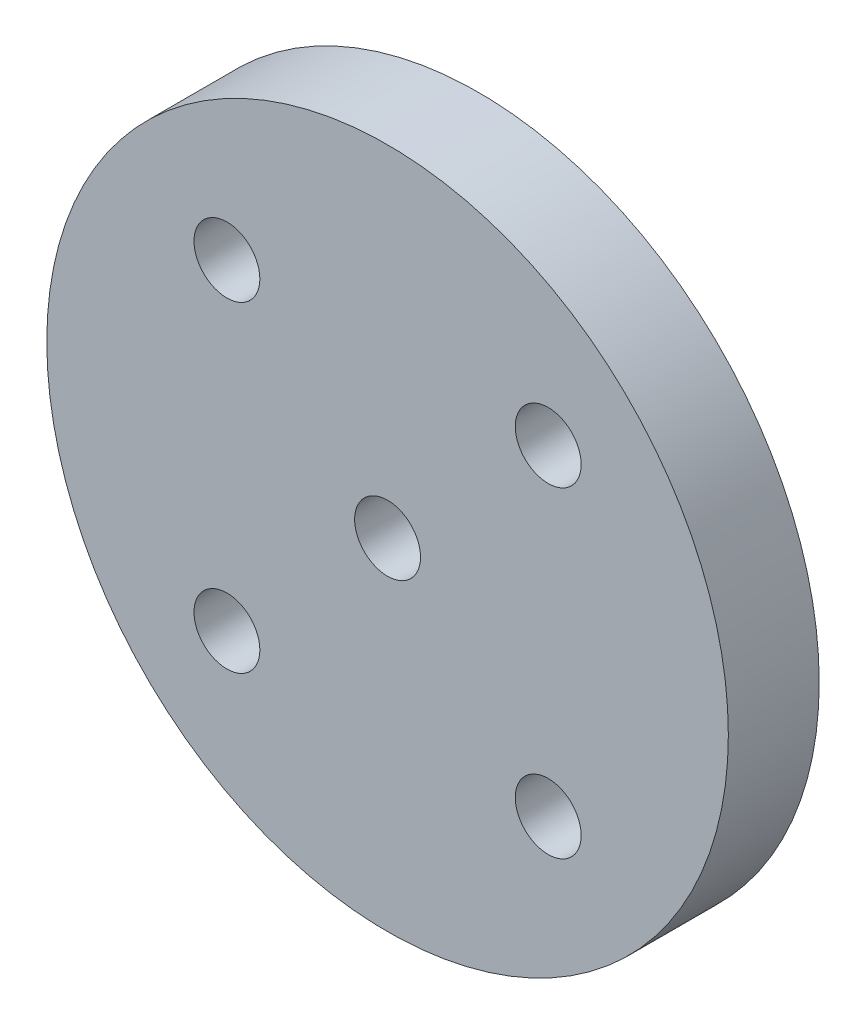
ISO-10303-21;
HEADER;
FILE_DESCRIPTION(('STEP AP214'),'2;1');
FILE_NAME('part.step','',(''),(''),'','','');
FILE_SCHEMA(('AUTOMOTIVE_DESIGN { 1 0 10303 214 1 1 1 1 }'));
ENDSEC;
DATA;
#1=APPLICATION_CONTEXT('core data for automotive mechanical design processes');
#2=APPLICATION_PROTOCOL_DEFINITION('international standard','automotive_design',2000,#1);
#3=PRODUCT_CONTEXT('',#1,'mechanical');
#4=PRODUCT('Part','Part','',(#3));
#5=PRODUCT_RELATED_PRODUCT_CATEGORY('part','',(#4));
#6=PRODUCT_DEFINITION_FORMATION('','',#4);
#7=PRODUCT_DEFINITION_CONTEXT('part definition',#1,'design');
#8=PRODUCT_DEFINITION('design','',#6,#7);
#9=PRODUCT_DEFINITION_SHAPE('','',#8);
#10=(LENGTH_UNIT() NAMED_UNIT(*) SI_UNIT(.MILLI.,.METRE.));
#11=(NAMED_UNIT(*) PLANE_ANGLE_UNIT() SI_UNIT($,.RADIAN.));
#12=(NAMED_UNIT(*) SI_UNIT($,.STERADIAN.) SOLID_ANGLE_UNIT());
#13=UNCERTAINTY_MEASURE_WITH_UNIT(LENGTH_MEASURE(1.E-05),#10,'distance_accuracy_value','');
#14=(GEOMETRIC_REPRESENTATION_CONTEXT(3) GLOBAL_UNCERTAINTY_ASSIGNED_CONTEXT((#13)) GLOBAL_UNIT_ASSIGNED_CONTEXT((#10,
#11,#12)) REPRESENTATION_CONTEXT('',''));
#15=CARTESIAN_POINT('',(0.,0.,0.));
#16=DIRECTION('',(0.,0.,1.));
#17=DIRECTION('',(1.,0.,0.));
#18=AXIS2_PLACEMENT_3D('',#15,#16,#17);
#19=CARTESIAN_POINT('',(0.,0.,4.));
#20=DIRECTION('',(0.,0.,1.));
#21=DIRECTION('',(1.,0.,0.));
#22=AXIS2_PLACEMENT_3D('',#19,#20,#21);
#23=PLANE('',#22);
#24=CARTESIAN_POINT('',(7.07106781186546,7.07106781186549,4.));
#25=DIRECTION('',(0.,0.,1.));
#26=DIRECTION('',(1.,0.,0.));
#27=AXIS2_PLACEMENT_3D('',#24,#25,#26);
#28=CIRCLE('',#27,1.45);
#29=CARTESIAN_POINT('',(8.52106781186546,7.07106781186549,4.));
#30=VERTEX_POINT('',#29);
#31=EDGE_CURVE('E61',#30,#30,#28,.T.);
#32=ORIENTED_EDGE('',*,*,#31,.F.);
#33=EDGE_LOOP('',(#32));
#34=FACE_BOUND('',#33,.T.);
#35=CARTESIAN_POINT('',(-7.07106781186541,-7.07106781186554,4.));
#36=DIRECTION('',(0.,0.,1.));
#37=DIRECTION('',(1.,0.,0.));
#38=AXIS2_PLACEMENT_3D('',#35,#36,#37);
#39=CIRCLE('',#38,1.45);
#40=CARTESIAN_POINT('',(-5.62106781186541,-7.07106781186554,4.));
#41=VERTEX_POINT('',#40);
#42=EDGE_CURVE('E49',#41,#41,#39,.T.);
#43=ORIENTED_EDGE('',*,*,#42,.F.);
#44=EDGE_LOOP('',(#43));
#45=FACE_BOUND('',#44,.T.);
#46=CARTESIAN_POINT('',(0.,0.,4.));
#47=DIRECTION('',(0.,0.,1.));
#48=DIRECTION('',(1.,0.,0.));
#49=AXIS2_PLACEMENT_3D('',#46,#47,#48);
#50=CIRCLE('',#49,15.);
#51=CARTESIAN_POINT('',(15.,0.,4.));
#52=VERTEX_POINT('',#51);
#53=EDGE_CURVE('E10',#52,#52,#50,.T.);
#54=ORIENTED_EDGE('',*,*,#53,.T.);
#55=EDGE_LOOP('',(#54));
#56=FACE_BOUND('',#55,.T.);
#57=CARTESIAN_POINT('',(0.,0.,4.));
#58=DIRECTION('',(0.,0.,1.));
#59=DIRECTION('',(1.,0.,0.));
#60=AXIS2_PLACEMENT_3D('',#57,#58,#59);
#61=CIRCLE('',#60,1.45);
#62=CARTESIAN_POINT('',(1.45,0.,4.));
#63=VERTEX_POINT('',#62);
#64=EDGE_CURVE('E44',#63,#63,#61,.T.);
#65=ORIENTED_EDGE('',*,*,#64,.F.);
#66=EDGE_LOOP('',(#65));
#67=FACE_BOUND('',#66,.T.);
#68=CARTESIAN_POINT('',(-7.07106781186551,7.07106781186544,4.));
#69=DIRECTION('',(0.,0.,1.));
#70=DIRECTION('',(1.,0.,0.));
#71=AXIS2_PLACEMENT_3D('',#68,#69,#70);
#72=CIRCLE('',#71,1.45);
#73=CARTESIAN_POINT('',(-5.62106781186551,7.07106781186544,4.));
#74=VERTEX_POINT('',#73);
#75=EDGE_CURVE('E55',#74,#74,#72,.T.);
#76=ORIENTED_EDGE('',*,*,#75,.F.);
#77=EDGE_LOOP('',(#76));
#78=FACE_BOUND('',#77,.T.);
#79=CARTESIAN_POINT('',(7.07106781186556,-7.07106781186538,4.));
#80=DIRECTION('',(0.,0.,1.));
#81=DIRECTION('',(1.,0.,0.));
#82=AXIS2_PLACEMENT_3D('',#79,#80,#81);
#83=CIRCLE('',#82,1.45);
#84=CARTESIAN_POINT('',(8.52106781186557,-7.07106781186538,4.));
#85=VERTEX_POINT('',#84);
#86=EDGE_CURVE('E67',#85,#85,#83,.T.);
#87=ORIENTED_EDGE('',*,*,#86,.F.);
#88=EDGE_LOOP('',(#87));
#89=FACE_BOUND('',#88,.T.);
#90=ADVANCED_FACE('F33',(#34,#45,#56,#67,#78,#89),#23,.T.);
#91=CARTESIAN_POINT('',(0.,0.,0.));
#92=DIRECTION('',(0.,0.,1.));
#93=DIRECTION('',(1.,0.,0.));
#94=AXIS2_PLACEMENT_3D('',#91,#92,#93);
#95=PLANE('',#94);
#96=CARTESIAN_POINT('',(0.,0.,0.));
#97=DIRECTION('',(0.,0.,1.));
#98=DIRECTION('',(1.,0.,0.));
#99=AXIS2_PLACEMENT_3D('',#96,#97,#98);
#100=CIRCLE('',#99,15.);
#101=CARTESIAN_POINT('',(15.,0.,0.));
#102=VERTEX_POINT('',#101);
#103=EDGE_CURVE('E37',#102,#102,#100,.T.);
#104=ORIENTED_EDGE('',*,*,#103,.F.);
#105=EDGE_LOOP('',(#104));
#106=FACE_BOUND('',#105,.T.);
#107=CARTESIAN_POINT('',(0.,0.,0.));
#108=DIRECTION('',(0.,0.,1.));
#109=DIRECTION('',(1.,0.,0.));
#110=AXIS2_PLACEMENT_3D('',#107,#108,#109);
#111=CIRCLE('',#110,1.45);
#112=CARTESIAN_POINT('',(1.45,0.,0.));
#113=VERTEX_POINT('',#112);
#114=EDGE_CURVE('E46',#113,#113,#111,.T.);
#115=ORIENTED_EDGE('',*,*,#114,.T.);
#116=EDGE_LOOP('',(#115));
#117=FACE_BOUND('',#116,.T.);
#118=CARTESIAN_POINT('',(-7.07106781186541,-7.07106781186554,0.));
#119=DIRECTION('',(0.,0.,1.));
#120=DIRECTION('',(1.,0.,0.));
#121=AXIS2_PLACEMENT_3D('',#118,#119,#120);
#122=CIRCLE('',#121,1.45);
#123=CARTESIAN_POINT('',(-5.62106781186541,-7.07106781186554,0.));
#124=VERTEX_POINT('',#123);
#125=EDGE_CURVE('E52',#124,#124,#122,.T.);
#126=ORIENTED_EDGE('',*,*,#125,.T.);
#127=EDGE_LOOP('',(#126));
#128=FACE_BOUND('',#127,.T.);
#129=CARTESIAN_POINT('',(-7.07106781186551,7.07106781186544,0.));
#130=DIRECTION('',(0.,0.,1.));
#131=DIRECTION('',(1.,0.,0.));
#132=AXIS2_PLACEMENT_3D('',#129,#130,#131);
#133=CIRCLE('',#132,1.45);
#134=CARTESIAN_POINT('',(-5.62106781186551,7.07106781186544,0.));
#135=VERTEX_POINT('',#134);
#136=EDGE_CURVE('E58',#135,#135,#133,.T.);
#137=ORIENTED_EDGE('',*,*,#136,.T.);
#138=EDGE_LOOP('',(#137));
#139=FACE_BOUND('',#138,.T.);
#140=CARTESIAN_POINT('',(7.07106781186546,7.07106781186549,0.));
#141=DIRECTION('',(0.,0.,1.));
#142=DIRECTION('',(1.,0.,0.));
#143=AXIS2_PLACEMENT_3D('',#140,#141,#142);
#144=CIRCLE('',#143,1.45);
#145=CARTESIAN_POINT('',(8.52106781186546,7.07106781186549,0.));
#146=VERTEX_POINT('',#145);
#147=EDGE_CURVE('E64',#146,#146,#144,.T.);
#148=ORIENTED_EDGE('',*,*,#147,.T.);
#149=EDGE_LOOP('',(#148));
#150=FACE_BOUND('',#149,.T.);
#151=CARTESIAN_POINT('',(7.07106781186556,-7.07106781186538,0.));
#152=DIRECTION('',(0.,0.,1.));
#153=DIRECTION('',(1.,0.,0.));
#154=AXIS2_PLACEMENT_3D('',#151,#152,#153);
#155=CIRCLE('',#154,1.45);
#156=CARTESIAN_POINT('',(8.52106781186557,-7.07106781186538,0.));
#157=VERTEX_POINT('',#156);
#158=EDGE_CURVE('E70',#157,#157,#155,.T.);
#159=ORIENTED_EDGE('',*,*,#158,.T.);
#160=EDGE_LOOP('',(#159));
#161=FACE_BOUND('',#160,.T.);
#162=ADVANCED_FACE('F80',(#106,#117,#128,#139,#150,#161),#95,.F.);
#163=CARTESIAN_POINT('',(0.,0.,4.));
#164=DIRECTION('',(0.,0.,-1.));
#165=DIRECTION('',(-1.,0.,0.));
#166=AXIS2_PLACEMENT_3D('',#163,#164,#165);
#167=CYLINDRICAL_SURFACE('',#166,15.);
#168=ORIENTED_EDGE('',*,*,#53,.F.);
#169=EDGE_LOOP('',(#168));
#170=FACE_BOUND('',#169,.T.);
#171=ORIENTED_EDGE('',*,*,#103,.T.);
#172=EDGE_LOOP('',(#171));
#173=FACE_BOUND('',#172,.T.);
#174=ADVANCED_FACE('F35',(#170,#173),#167,.T.);
#175=CARTESIAN_POINT('',(0.,0.,4.));
#176=DIRECTION('',(0.,0.,-1.));
#177=DIRECTION('',(-1.,0.,0.));
#178=AXIS2_PLACEMENT_3D('',#175,#176,#177);
#179=CYLINDRICAL_SURFACE('',#178,1.45);
#180=ORIENTED_EDGE('',*,*,#64,.T.);
#181=EDGE_LOOP('',(#180));
#182=FACE_BOUND('',#181,.T.);
#183=ORIENTED_EDGE('',*,*,#114,.F.);
#184=EDGE_LOOP('',(#183));
#185=FACE_BOUND('',#184,.T.);
#186=ADVANCED_FACE('F90',(#182,#185),#179,.F.);
#187=CARTESIAN_POINT('',(-7.07106781186541,-7.07106781186554,4.));
#188=DIRECTION('',(0.,0.,-1.));
#189=DIRECTION('',(-1.,0.,0.));
#190=AXIS2_PLACEMENT_3D('',#187,#188,#189);
#191=CYLINDRICAL_SURFACE('',#190,1.45);
#192=ORIENTED_EDGE('',*,*,#42,.T.);
#193=EDGE_LOOP('',(#192));
#194=FACE_BOUND('',#193,.T.);
#195=ORIENTED_EDGE('',*,*,#125,.F.);
#196=EDGE_LOOP('',(#195));
#197=FACE_BOUND('',#196,.T.);
#198=ADVANCED_FACE('F93',(#194,#197),#191,.F.);
#199=CARTESIAN_POINT('',(-7.07106781186551,7.07106781186544,4.));
#200=DIRECTION('',(0.,0.,-1.));
#201=DIRECTION('',(-1.,0.,0.));
#202=AXIS2_PLACEMENT_3D('',#199,#200,#201);
#203=CYLINDRICAL_SURFACE('',#202,1.45);
#204=ORIENTED_EDGE('',*,*,#75,.T.);
#205=EDGE_LOOP('',(#204));
#206=FACE_BOUND('',#205,.T.);
#207=ORIENTED_EDGE('',*,*,#136,.F.);
#208=EDGE_LOOP('',(#207));
#209=FACE_BOUND('',#208,.T.);
#210=ADVANCED_FACE('F97',(#206,#209),#203,.F.);
#211=CARTESIAN_POINT('',(7.07106781186546,7.07106781186549,4.));
#212=DIRECTION('',(0.,0.,-1.));
#213=DIRECTION('',(-1.,0.,0.));
#214=AXIS2_PLACEMENT_3D('',#211,#212,#213);
#215=CYLINDRICAL_SURFACE('',#214,1.45);
#216=ORIENTED_EDGE('',*,*,#31,.T.);
#217=EDGE_LOOP('',(#216));
#218=FACE_BOUND('',#217,.T.);
#219=ORIENTED_EDGE('',*,*,#147,.F.);
#220=EDGE_LOOP('',(#219));
#221=FACE_BOUND('',#220,.T.);
#222=ADVANCED_FACE('F101',(#218,#221),#215,.F.);
#223=CARTESIAN_POINT('',(7.07106781186556,-7.07106781186538,4.));
#224=DIRECTION('',(0.,0.,-1.));
#225=DIRECTION('',(-1.,0.,0.));
#226=AXIS2_PLACEMENT_3D('',#223,#224,#225);
#227=CYLINDRICAL_SURFACE('',#226,1.45);
#228=ORIENTED_EDGE('',*,*,#86,.T.);
#229=EDGE_LOOP('',(#228));
#230=FACE_BOUND('',#229,.T.);
#231=ORIENTED_EDGE('',*,*,#158,.F.);
#232=EDGE_LOOP('',(#231));
#233=FACE_BOUND('',#232,.T.);
#234=ADVANCED_FACE('F76',(#230,#233),#227,.F.);
#235=CLOSED_SHELL('',(#90,#162,#174,#186,#198,#210,#222,#234));
#236=MANIFOLD_SOLID_BREP('B2',#235);
#237=ADVANCED_BREP_SHAPE_REPRESENTATION('',(#18,#236),#14);
#238=SHAPE_DEFINITION_REPRESENTATION(#9,#237);
ENDSEC;
END-ISO-10303-21;
